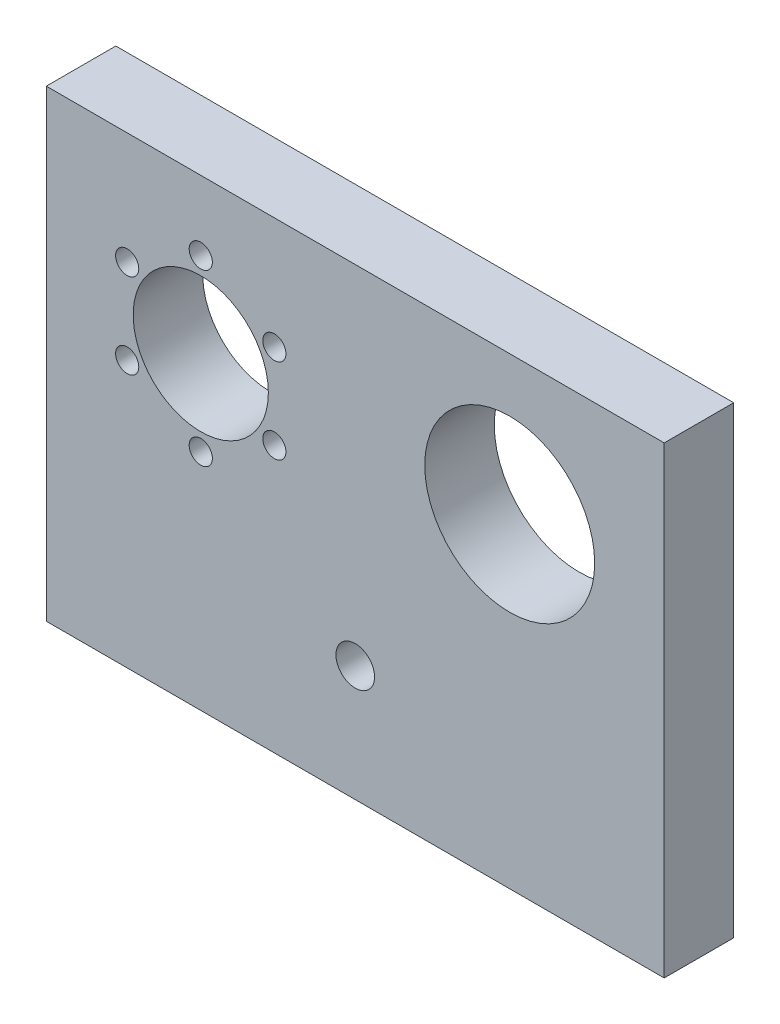
ISO-10303-21;
HEADER;
FILE_DESCRIPTION(('STEP AP214'),'2;1');
FILE_NAME('part.step','',(''),(''),'','','');
FILE_SCHEMA(('AUTOMOTIVE_DESIGN { 1 0 10303 214 1 1 1 1 }'));
ENDSEC;
DATA;
#1=APPLICATION_CONTEXT('core data for automotive mechanical design processes');
#2=APPLICATION_PROTOCOL_DEFINITION('international standard','automotive_design',2000,#1);
#3=PRODUCT_CONTEXT('',#1,'mechanical');
#4=PRODUCT('Part','Part','',(#3));
#5=PRODUCT_RELATED_PRODUCT_CATEGORY('part','',(#4));
#6=PRODUCT_DEFINITION_FORMATION('','',#4);
#7=PRODUCT_DEFINITION_CONTEXT('part definition',#1,'design');
#8=PRODUCT_DEFINITION('design','',#6,#7);
#9=PRODUCT_DEFINITION_SHAPE('','',#8);
#10=(LENGTH_UNIT() NAMED_UNIT(*) SI_UNIT(.MILLI.,.METRE.));
#11=(NAMED_UNIT(*) PLANE_ANGLE_UNIT() SI_UNIT($,.RADIAN.));
#12=(NAMED_UNIT(*) SI_UNIT($,.STERADIAN.) SOLID_ANGLE_UNIT());
#13=UNCERTAINTY_MEASURE_WITH_UNIT(LENGTH_MEASURE(1.E-05),#10,'distance_accuracy_value','');
#14=(GEOMETRIC_REPRESENTATION_CONTEXT(3) GLOBAL_UNCERTAINTY_ASSIGNED_CONTEXT((#13)) GLOBAL_UNIT_ASSIGNED_CONTEXT((#10,
#11,#12)) REPRESENTATION_CONTEXT('',''));
#15=CARTESIAN_POINT('',(0.,0.,0.));
#16=DIRECTION('',(0.,0.,1.));
#17=DIRECTION('',(1.,0.,0.));
#18=AXIS2_PLACEMENT_3D('',#15,#16,#17);
#19=CARTESIAN_POINT('',(0.,0.,9.));
#20=DIRECTION('',(1.,0.,0.));
#21=DIRECTION('',(0.,0.,-1.));
#22=AXIS2_PLACEMENT_3D('',#19,#20,#21);
#23=PLANE('',#22);
#24=DIRECTION('',(0.,-1.,0.));
#25=VECTOR('',#24,1.);
#26=CARTESIAN_POINT('',(0.,0.,0.));
#27=LINE('',#26,#25);
#28=CARTESIAN_POINT('',(0.,60.,0.));
#29=VERTEX_POINT('',#28);
#30=CARTESIAN_POINT('',(0.,0.,0.));
#31=VERTEX_POINT('',#30);
#32=EDGE_CURVE('E96',#29,#31,#27,.T.);
#33=ORIENTED_EDGE('',*,*,#32,.T.);
#34=DIRECTION('',(0.,0.,-1.));
#35=VECTOR('',#34,1.);
#36=CARTESIAN_POINT('',(0.,0.,9.));
#37=LINE('',#36,#35);
#38=CARTESIAN_POINT('',(0.,0.,9.));
#39=VERTEX_POINT('',#38);
#40=EDGE_CURVE('E11',#39,#31,#37,.T.);
#41=ORIENTED_EDGE('',*,*,#40,.F.);
#42=DIRECTION('',(0.,-1.,0.));
#43=VECTOR('',#42,1.);
#44=CARTESIAN_POINT('',(0.,0.,9.));
#45=LINE('',#44,#43);
#46=CARTESIAN_POINT('',(0.,60.,9.));
#47=VERTEX_POINT('',#46);
#48=EDGE_CURVE('E84',#47,#39,#45,.T.);
#49=ORIENTED_EDGE('',*,*,#48,.F.);
#50=DIRECTION('',(0.,0.,-1.));
#51=VECTOR('',#50,1.);
#52=CARTESIAN_POINT('',(0.,60.,9.));
#53=LINE('',#52,#51);
#54=EDGE_CURVE('E92',#47,#29,#53,.T.);
#55=ORIENTED_EDGE('',*,*,#54,.T.);
#56=EDGE_LOOP('',(#33,#41,#49,#55));
#57=FACE_BOUND('',#56,.T.);
#58=ADVANCED_FACE('F33',(#57),#23,.F.);
#59=CARTESIAN_POINT('',(0.,0.,9.));
#60=DIRECTION('',(0.,1.,0.));
#61=DIRECTION('',(0.,0.,1.));
#62=AXIS2_PLACEMENT_3D('',#59,#60,#61);
#63=PLANE('',#62);
#64=DIRECTION('',(1.,0.,0.));
#65=VECTOR('',#64,1.);
#66=CARTESIAN_POINT('',(0.,0.,0.));
#67=LINE('',#66,#65);
#68=CARTESIAN_POINT('',(80.,0.,0.));
#69=VERTEX_POINT('',#68);
#70=EDGE_CURVE('E88',#31,#69,#67,.T.);
#71=ORIENTED_EDGE('',*,*,#70,.T.);
#72=DIRECTION('',(0.,0.,-1.));
#73=VECTOR('',#72,1.);
#74=CARTESIAN_POINT('',(80.,0.,9.));
#75=LINE('',#74,#73);
#76=CARTESIAN_POINT('',(80.,0.,9.));
#77=VERTEX_POINT('',#76);
#78=EDGE_CURVE('E41',#77,#69,#75,.T.);
#79=ORIENTED_EDGE('',*,*,#78,.F.);
#80=DIRECTION('',(1.,0.,0.));
#81=VECTOR('',#80,1.);
#82=CARTESIAN_POINT('',(0.,0.,9.));
#83=LINE('',#82,#81);
#84=EDGE_CURVE('E79',#39,#77,#83,.T.);
#85=ORIENTED_EDGE('',*,*,#84,.F.);
#86=ORIENTED_EDGE('',*,*,#40,.T.);
#87=EDGE_LOOP('',(#71,#79,#85,#86));
#88=FACE_BOUND('',#87,.T.);
#89=ADVANCED_FACE('F87',(#88),#63,.F.);
#90=CARTESIAN_POINT('',(80.,0.,9.));
#91=DIRECTION('',(-1.,0.,0.));
#92=DIRECTION('',(0.,0.,1.));
#93=AXIS2_PLACEMENT_3D('',#90,#91,#92);
#94=PLANE('',#93);
#95=DIRECTION('',(0.,1.,0.));
#96=VECTOR('',#95,1.);
#97=CARTESIAN_POINT('',(80.,0.,0.));
#98=LINE('',#97,#96);
#99=CARTESIAN_POINT('',(80.,60.,0.));
#100=VERTEX_POINT('',#99);
#101=EDGE_CURVE('E66',#69,#100,#98,.T.);
#102=ORIENTED_EDGE('',*,*,#101,.T.);
#103=DIRECTION('',(0.,0.,-1.));
#104=VECTOR('',#103,1.);
#105=CARTESIAN_POINT('',(80.,60.,9.));
#106=LINE('',#105,#104);
#107=CARTESIAN_POINT('',(80.,60.,9.));
#108=VERTEX_POINT('',#107);
#109=EDGE_CURVE('E89',#108,#100,#106,.T.);
#110=ORIENTED_EDGE('',*,*,#109,.F.);
#111=DIRECTION('',(0.,1.,0.));
#112=VECTOR('',#111,1.);
#113=CARTESIAN_POINT('',(80.,0.,9.));
#114=LINE('',#113,#112);
#115=EDGE_CURVE('E82',#77,#108,#114,.T.);
#116=ORIENTED_EDGE('',*,*,#115,.F.);
#117=ORIENTED_EDGE('',*,*,#78,.T.);
#118=EDGE_LOOP('',(#102,#110,#116,#117));
#119=FACE_BOUND('',#118,.T.);
#120=ADVANCED_FACE('F90',(#119),#94,.F.);
#121=CARTESIAN_POINT('',(0.,60.,9.));
#122=DIRECTION('',(0.,-1.,0.));
#123=DIRECTION('',(0.,0.,-1.));
#124=AXIS2_PLACEMENT_3D('',#121,#122,#123);
#125=PLANE('',#124);
#126=DIRECTION('',(-1.,0.,0.));
#127=VECTOR('',#126,1.);
#128=CARTESIAN_POINT('',(0.,60.,0.));
#129=LINE('',#128,#127);
#130=EDGE_CURVE('E72',#100,#29,#129,.T.);
#131=ORIENTED_EDGE('',*,*,#130,.T.);
#132=ORIENTED_EDGE('',*,*,#54,.F.);
#133=DIRECTION('',(-1.,0.,0.));
#134=VECTOR('',#133,1.);
#135=CARTESIAN_POINT('',(0.,60.,9.));
#136=LINE('',#135,#134);
#137=EDGE_CURVE('E49',#108,#47,#136,.T.);
#138=ORIENTED_EDGE('',*,*,#137,.F.);
#139=ORIENTED_EDGE('',*,*,#109,.T.);
#140=EDGE_LOOP('',(#131,#132,#138,#139));
#141=FACE_BOUND('',#140,.T.);
#142=ADVANCED_FACE('F104',(#141),#125,.F.);
#143=CARTESIAN_POINT('',(0.,0.,9.));
#144=DIRECTION('',(0.,0.,-1.));
#145=DIRECTION('',(-1.,0.,0.));
#146=AXIS2_PLACEMENT_3D('',#143,#144,#145);
#147=PLANE('',#146);
#148=CARTESIAN_POINT('',(40.,15.,9.));
#149=DIRECTION('',(0.,0.,1.));
#150=DIRECTION('',(1.,0.,0.));
#151=AXIS2_PLACEMENT_3D('',#148,#149,#150);
#152=CIRCLE('',#151,2.5);
#153=CARTESIAN_POINT('',(42.5,15.,9.));
#154=VERTEX_POINT('',#153);
#155=EDGE_CURVE('E158',#154,#154,#152,.T.);
#156=ORIENTED_EDGE('',*,*,#155,.F.);
#157=EDGE_LOOP('',(#156));
#158=FACE_BOUND('',#157,.T.);
#159=CARTESIAN_POINT('',(10.4737205583712,45.5,9.));
#160=DIRECTION('',(0.,0.,1.));
#161=DIRECTION('',(1.,0.,0.));
#162=AXIS2_PLACEMENT_3D('',#159,#160,#161);
#163=CIRCLE('',#162,1.5);
#164=CARTESIAN_POINT('',(11.9737205583712,45.5,9.));
#165=VERTEX_POINT('',#164);
#166=EDGE_CURVE('E134',#165,#165,#163,.T.);
#167=ORIENTED_EDGE('',*,*,#166,.F.);
#168=EDGE_LOOP('',(#167));
#169=FACE_BOUND('',#168,.T.);
#170=CARTESIAN_POINT('',(10.4737205583712,34.5,9.));
#171=DIRECTION('',(0.,0.,1.));
#172=DIRECTION('',(1.,0.,0.));
#173=AXIS2_PLACEMENT_3D('',#170,#171,#172);
#174=CIRCLE('',#173,1.5);
#175=CARTESIAN_POINT('',(11.9737205583712,34.5,9.));
#176=VERTEX_POINT('',#175);
#177=EDGE_CURVE('E141',#176,#176,#174,.T.);
#178=ORIENTED_EDGE('',*,*,#177,.F.);
#179=EDGE_LOOP('',(#178));
#180=FACE_BOUND('',#179,.T.);
#181=CARTESIAN_POINT('',(20.,29.,9.));
#182=DIRECTION('',(0.,0.,1.));
#183=DIRECTION('',(1.,0.,0.));
#184=AXIS2_PLACEMENT_3D('',#181,#182,#183);
#185=CIRCLE('',#184,1.5);
#186=CARTESIAN_POINT('',(21.5,29.,9.));
#187=VERTEX_POINT('',#186);
#188=EDGE_CURVE('E147',#187,#187,#185,.T.);
#189=ORIENTED_EDGE('',*,*,#188,.F.);
#190=EDGE_LOOP('',(#189));
#191=FACE_BOUND('',#190,.T.);
#192=CARTESIAN_POINT('',(29.5262794416288,34.5,9.));
#193=DIRECTION('',(0.,0.,1.));
#194=DIRECTION('',(1.,0.,0.));
#195=AXIS2_PLACEMENT_3D('',#192,#193,#194);
#196=CIRCLE('',#195,1.5);
#197=CARTESIAN_POINT('',(31.0262794416288,34.5,9.));
#198=VERTEX_POINT('',#197);
#199=EDGE_CURVE('E153',#198,#198,#196,.T.);
#200=ORIENTED_EDGE('',*,*,#199,.F.);
#201=EDGE_LOOP('',(#200));
#202=FACE_BOUND('',#201,.T.);
#203=CARTESIAN_POINT('',(20.,40.,9.));
#204=DIRECTION('',(0.,0.,1.));
#205=DIRECTION('',(1.,0.,0.));
#206=AXIS2_PLACEMENT_3D('',#203,#204,#205);
#207=CIRCLE('',#206,8.75);
#208=CARTESIAN_POINT('',(28.75,40.,9.));
#209=VERTEX_POINT('',#208);
#210=EDGE_CURVE('E116',#209,#209,#207,.T.);
#211=ORIENTED_EDGE('',*,*,#210,.F.);
#212=EDGE_LOOP('',(#211));
#213=FACE_BOUND('',#212,.T.);
#214=CARTESIAN_POINT('',(20.,51.,9.));
#215=DIRECTION('',(0.,0.,1.));
#216=DIRECTION('',(1.,0.,0.));
#217=AXIS2_PLACEMENT_3D('',#214,#215,#216);
#218=CIRCLE('',#217,1.5);
#219=CARTESIAN_POINT('',(21.5,51.,9.));
#220=VERTEX_POINT('',#219);
#221=EDGE_CURVE('E129',#220,#220,#218,.T.);
#222=ORIENTED_EDGE('',*,*,#221,.F.);
#223=EDGE_LOOP('',(#222));
#224=FACE_BOUND('',#223,.T.);
#225=CARTESIAN_POINT('',(29.5262794416288,45.5,9.));
#226=DIRECTION('',(0.,0.,1.));
#227=DIRECTION('',(1.,0.,0.));
#228=AXIS2_PLACEMENT_3D('',#225,#226,#227);
#229=CIRCLE('',#228,1.5);
#230=CARTESIAN_POINT('',(31.0262794416288,45.5,9.));
#231=VERTEX_POINT('',#230);
#232=EDGE_CURVE('E122',#231,#231,#229,.T.);
#233=ORIENTED_EDGE('',*,*,#232,.F.);
#234=EDGE_LOOP('',(#233));
#235=FACE_BOUND('',#234,.T.);
#236=CARTESIAN_POINT('',(60.,42.,9.));
#237=DIRECTION('',(0.,0.,1.));
#238=DIRECTION('',(1.,0.,0.));
#239=AXIS2_PLACEMENT_3D('',#236,#237,#238);
#240=CIRCLE('',#239,11.);
#241=CARTESIAN_POINT('',(71.,42.,9.));
#242=VERTEX_POINT('',#241);
#243=EDGE_CURVE('E110',#242,#242,#240,.T.);
#244=ORIENTED_EDGE('',*,*,#243,.F.);
#245=EDGE_LOOP('',(#244));
#246=FACE_BOUND('',#245,.T.);
#247=ORIENTED_EDGE('',*,*,#48,.T.);
#248=ORIENTED_EDGE('',*,*,#84,.T.);
#249=ORIENTED_EDGE('',*,*,#115,.T.);
#250=ORIENTED_EDGE('',*,*,#137,.T.);
#251=EDGE_LOOP('',(#247,#248,#249,#250));
#252=FACE_BOUND('',#251,.T.);
#253=ADVANCED_FACE('F80',(#158,#169,#180,#191,#202,#213,#224,#235,#246,#252),#147,.F.);
#254=CARTESIAN_POINT('',(0.,0.,0.));
#255=DIRECTION('',(0.,0.,-1.));
#256=DIRECTION('',(-1.,0.,0.));
#257=AXIS2_PLACEMENT_3D('',#254,#255,#256);
#258=PLANE('',#257);
#259=CARTESIAN_POINT('',(40.,15.,0.));
#260=DIRECTION('',(0.,0.,1.));
#261=DIRECTION('',(1.,0.,0.));
#262=AXIS2_PLACEMENT_3D('',#259,#260,#261);
#263=CIRCLE('',#262,2.5);
#264=CARTESIAN_POINT('',(42.5,15.,0.));
#265=VERTEX_POINT('',#264);
#266=EDGE_CURVE('E138',#265,#265,#263,.T.);
#267=ORIENTED_EDGE('',*,*,#266,.T.);
#268=EDGE_LOOP('',(#267));
#269=FACE_BOUND('',#268,.T.);
#270=CARTESIAN_POINT('',(10.4737205583712,45.5,0.));
#271=DIRECTION('',(0.,0.,1.));
#272=DIRECTION('',(1.,0.,0.));
#273=AXIS2_PLACEMENT_3D('',#270,#271,#272);
#274=CIRCLE('',#273,1.5);
#275=CARTESIAN_POINT('',(11.9737205583712,45.5,0.));
#276=VERTEX_POINT('',#275);
#277=EDGE_CURVE('E137',#276,#276,#274,.T.);
#278=ORIENTED_EDGE('',*,*,#277,.T.);
#279=EDGE_LOOP('',(#278));
#280=FACE_BOUND('',#279,.T.);
#281=CARTESIAN_POINT('',(10.4737205583712,34.5,0.));
#282=DIRECTION('',(0.,0.,1.));
#283=DIRECTION('',(1.,0.,0.));
#284=AXIS2_PLACEMENT_3D('',#281,#282,#283);
#285=CIRCLE('',#284,1.5);
#286=CARTESIAN_POINT('',(11.9737205583712,34.5,0.));
#287=VERTEX_POINT('',#286);
#288=EDGE_CURVE('E144',#287,#287,#285,.T.);
#289=ORIENTED_EDGE('',*,*,#288,.T.);
#290=EDGE_LOOP('',(#289));
#291=FACE_BOUND('',#290,.T.);
#292=CARTESIAN_POINT('',(20.,29.,0.));
#293=DIRECTION('',(0.,0.,1.));
#294=DIRECTION('',(1.,0.,0.));
#295=AXIS2_PLACEMENT_3D('',#292,#293,#294);
#296=CIRCLE('',#295,1.5);
#297=CARTESIAN_POINT('',(21.5,29.,0.));
#298=VERTEX_POINT('',#297);
#299=EDGE_CURVE('E150',#298,#298,#296,.T.);
#300=ORIENTED_EDGE('',*,*,#299,.T.);
#301=EDGE_LOOP('',(#300));
#302=FACE_BOUND('',#301,.T.);
#303=CARTESIAN_POINT('',(29.5262794416288,34.5,0.));
#304=DIRECTION('',(0.,0.,1.));
#305=DIRECTION('',(1.,0.,0.));
#306=AXIS2_PLACEMENT_3D('',#303,#304,#305);
#307=CIRCLE('',#306,1.5);
#308=CARTESIAN_POINT('',(31.0262794416288,34.5,0.));
#309=VERTEX_POINT('',#308);
#310=EDGE_CURVE('E126',#309,#309,#307,.T.);
#311=ORIENTED_EDGE('',*,*,#310,.T.);
#312=EDGE_LOOP('',(#311));
#313=FACE_BOUND('',#312,.T.);
#314=CARTESIAN_POINT('',(20.,40.,0.));
#315=DIRECTION('',(0.,0.,1.));
#316=DIRECTION('',(1.,0.,0.));
#317=AXIS2_PLACEMENT_3D('',#314,#315,#316);
#318=CIRCLE('',#317,8.75);
#319=CARTESIAN_POINT('',(28.75,40.,0.));
#320=VERTEX_POINT('',#319);
#321=EDGE_CURVE('E113',#320,#320,#318,.T.);
#322=ORIENTED_EDGE('',*,*,#321,.T.);
#323=EDGE_LOOP('',(#322));
#324=FACE_BOUND('',#323,.T.);
#325=CARTESIAN_POINT('',(20.,51.,0.));
#326=DIRECTION('',(0.,0.,1.));
#327=DIRECTION('',(1.,0.,0.));
#328=AXIS2_PLACEMENT_3D('',#325,#326,#327);
#329=CIRCLE('',#328,1.5);
#330=CARTESIAN_POINT('',(21.5,51.,0.));
#331=VERTEX_POINT('',#330);
#332=EDGE_CURVE('E119',#331,#331,#329,.T.);
#333=ORIENTED_EDGE('',*,*,#332,.T.);
#334=EDGE_LOOP('',(#333));
#335=FACE_BOUND('',#334,.T.);
#336=CARTESIAN_POINT('',(29.5262794416288,45.5,0.));
#337=DIRECTION('',(0.,0.,1.));
#338=DIRECTION('',(1.,0.,0.));
#339=AXIS2_PLACEMENT_3D('',#336,#337,#338);
#340=CIRCLE('',#339,1.5);
#341=CARTESIAN_POINT('',(31.0262794416288,45.5,0.));
#342=VERTEX_POINT('',#341);
#343=EDGE_CURVE('E125',#342,#342,#340,.T.);
#344=ORIENTED_EDGE('',*,*,#343,.T.);
#345=EDGE_LOOP('',(#344));
#346=FACE_BOUND('',#345,.T.);
#347=CARTESIAN_POINT('',(60.,42.,0.));
#348=DIRECTION('',(0.,0.,1.));
#349=DIRECTION('',(1.,0.,0.));
#350=AXIS2_PLACEMENT_3D('',#347,#348,#349);
#351=CIRCLE('',#350,11.);
#352=CARTESIAN_POINT('',(71.,42.,0.));
#353=VERTEX_POINT('',#352);
#354=EDGE_CURVE('E99',#353,#353,#351,.T.);
#355=ORIENTED_EDGE('',*,*,#354,.T.);
#356=EDGE_LOOP('',(#355));
#357=FACE_BOUND('',#356,.T.);
#358=ORIENTED_EDGE('',*,*,#32,.F.);
#359=ORIENTED_EDGE('',*,*,#130,.F.);
#360=ORIENTED_EDGE('',*,*,#101,.F.);
#361=ORIENTED_EDGE('',*,*,#70,.F.);
#362=EDGE_LOOP('',(#358,#359,#360,#361));
#363=FACE_BOUND('',#362,.T.);
#364=ADVANCED_FACE('F107',(#269,#280,#291,#302,#313,#324,#335,#346,#357,#363),#258,.T.);
#365=CARTESIAN_POINT('',(60.,42.,0.));
#366=DIRECTION('',(0.,0.,1.));
#367=DIRECTION('',(1.,0.,0.));
#368=AXIS2_PLACEMENT_3D('',#365,#366,#367);
#369=CYLINDRICAL_SURFACE('',#368,11.);
#370=ORIENTED_EDGE('',*,*,#354,.F.);
#371=EDGE_LOOP('',(#370));
#372=FACE_BOUND('',#371,.T.);
#373=ORIENTED_EDGE('',*,*,#243,.T.);
#374=EDGE_LOOP('',(#373));
#375=FACE_BOUND('',#374,.T.);
#376=ADVANCED_FACE('F192',(#372,#375),#369,.F.);
#377=CARTESIAN_POINT('',(29.5262794416288,45.5,0.));
#378=DIRECTION('',(0.,0.,1.));
#379=DIRECTION('',(1.,0.,0.));
#380=AXIS2_PLACEMENT_3D('',#377,#378,#379);
#381=CYLINDRICAL_SURFACE('',#380,1.5);
#382=ORIENTED_EDGE('',*,*,#343,.F.);
#383=EDGE_LOOP('',(#382));
#384=FACE_BOUND('',#383,.T.);
#385=ORIENTED_EDGE('',*,*,#232,.T.);
#386=EDGE_LOOP('',(#385));
#387=FACE_BOUND('',#386,.T.);
#388=ADVANCED_FACE('F194',(#384,#387),#381,.F.);
#389=CARTESIAN_POINT('',(20.,51.,0.));
#390=DIRECTION('',(0.,0.,1.));
#391=DIRECTION('',(1.,0.,0.));
#392=AXIS2_PLACEMENT_3D('',#389,#390,#391);
#393=CYLINDRICAL_SURFACE('',#392,1.5);
#394=ORIENTED_EDGE('',*,*,#332,.F.);
#395=EDGE_LOOP('',(#394));
#396=FACE_BOUND('',#395,.T.);
#397=ORIENTED_EDGE('',*,*,#221,.T.);
#398=EDGE_LOOP('',(#397));
#399=FACE_BOUND('',#398,.T.);
#400=ADVANCED_FACE('F201',(#396,#399),#393,.F.);
#401=CARTESIAN_POINT('',(20.,40.,0.));
#402=DIRECTION('',(0.,0.,1.));
#403=DIRECTION('',(1.,0.,0.));
#404=AXIS2_PLACEMENT_3D('',#401,#402,#403);
#405=CYLINDRICAL_SURFACE('',#404,8.75);
#406=ORIENTED_EDGE('',*,*,#321,.F.);
#407=EDGE_LOOP('',(#406));
#408=FACE_BOUND('',#407,.T.);
#409=ORIENTED_EDGE('',*,*,#210,.T.);
#410=EDGE_LOOP('',(#409));
#411=FACE_BOUND('',#410,.T.);
#412=ADVANCED_FACE('F268',(#408,#411),#405,.F.);
#413=CARTESIAN_POINT('',(29.5262794416288,34.5,0.));
#414=DIRECTION('',(0.,0.,1.));
#415=DIRECTION('',(1.,0.,0.));
#416=AXIS2_PLACEMENT_3D('',#413,#414,#415);
#417=CYLINDRICAL_SURFACE('',#416,1.5);
#418=ORIENTED_EDGE('',*,*,#310,.F.);
#419=EDGE_LOOP('',(#418));
#420=FACE_BOUND('',#419,.T.);
#421=ORIENTED_EDGE('',*,*,#199,.T.);
#422=EDGE_LOOP('',(#421));
#423=FACE_BOUND('',#422,.T.);
#424=ADVANCED_FACE('F260',(#420,#423),#417,.F.);
#425=CARTESIAN_POINT('',(20.,29.,0.));
#426=DIRECTION('',(0.,0.,1.));
#427=DIRECTION('',(1.,0.,0.));
#428=AXIS2_PLACEMENT_3D('',#425,#426,#427);
#429=CYLINDRICAL_SURFACE('',#428,1.5);
#430=ORIENTED_EDGE('',*,*,#299,.F.);
#431=EDGE_LOOP('',(#430));
#432=FACE_BOUND('',#431,.T.);
#433=ORIENTED_EDGE('',*,*,#188,.T.);
#434=EDGE_LOOP('',(#433));
#435=FACE_BOUND('',#434,.T.);
#436=ADVANCED_FACE('F252',(#432,#435),#429,.F.);
#437=CARTESIAN_POINT('',(10.4737205583712,34.5,0.));
#438=DIRECTION('',(0.,0.,1.));
#439=DIRECTION('',(1.,0.,0.));
#440=AXIS2_PLACEMENT_3D('',#437,#438,#439);
#441=CYLINDRICAL_SURFACE('',#440,1.5);
#442=ORIENTED_EDGE('',*,*,#288,.F.);
#443=EDGE_LOOP('',(#442));
#444=FACE_BOUND('',#443,.T.);
#445=ORIENTED_EDGE('',*,*,#177,.T.);
#446=EDGE_LOOP('',(#445));
#447=FACE_BOUND('',#446,.T.);
#448=ADVANCED_FACE('F245',(#444,#447),#441,.F.);
#449=CARTESIAN_POINT('',(10.4737205583712,45.5,0.));
#450=DIRECTION('',(0.,0.,1.));
#451=DIRECTION('',(1.,0.,0.));
#452=AXIS2_PLACEMENT_3D('',#449,#450,#451);
#453=CYLINDRICAL_SURFACE('',#452,1.5);
#454=ORIENTED_EDGE('',*,*,#277,.F.);
#455=EDGE_LOOP('',(#454));
#456=FACE_BOUND('',#455,.T.);
#457=ORIENTED_EDGE('',*,*,#166,.T.);
#458=EDGE_LOOP('',(#457));
#459=FACE_BOUND('',#458,.T.);
#460=ADVANCED_FACE('F169',(#456,#459),#453,.F.);
#461=CARTESIAN_POINT('',(40.,15.,0.));
#462=DIRECTION('',(0.,0.,1.));
#463=DIRECTION('',(1.,0.,0.));
#464=AXIS2_PLACEMENT_3D('',#461,#462,#463);
#465=CYLINDRICAL_SURFACE('',#464,2.5);
#466=ORIENTED_EDGE('',*,*,#266,.F.);
#467=EDGE_LOOP('',(#466));
#468=FACE_BOUND('',#467,.T.);
#469=ORIENTED_EDGE('',*,*,#155,.T.);
#470=EDGE_LOOP('',(#469));
#471=FACE_BOUND('',#470,.T.);
#472=ADVANCED_FACE('F166',(#468,#471),#465,.F.);
#473=CLOSED_SHELL('',(#58,#89,#120,#142,#253,#364,#376,#388,#400,#412,#424,#436,#448,#460,#472));
#474=MANIFOLD_SOLID_BREP('B2',#473);
#475=ADVANCED_BREP_SHAPE_REPRESENTATION('',(#18,#474),#14);
#476=SHAPE_DEFINITION_REPRESENTATION(#9,#475);
ENDSEC;
END-ISO-10303-21;
